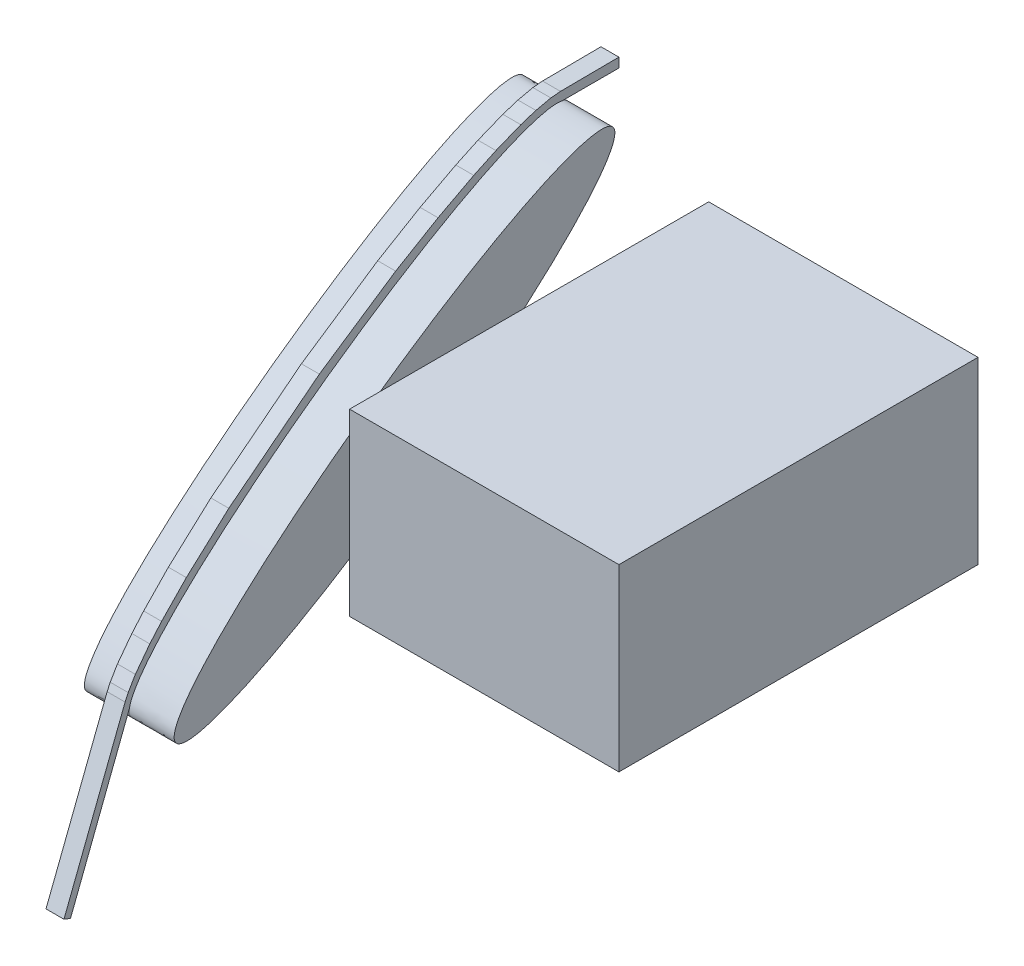
ISO-10303-21;
HEADER;
FILE_DESCRIPTION(('STEP AP214'),'2;1');
FILE_NAME('part.step','',(''),(''),'','','');
FILE_SCHEMA(('AUTOMOTIVE_DESIGN { 1 0 10303 214 1 1 1 1 }'));
ENDSEC;
DATA;
#1=APPLICATION_CONTEXT('core data for automotive mechanical design processes');
#2=APPLICATION_PROTOCOL_DEFINITION('international standard','automotive_design',2000,#1);
#3=PRODUCT_CONTEXT('',#1,'mechanical');
#4=PRODUCT('Part','Part','',(#3));
#5=PRODUCT_RELATED_PRODUCT_CATEGORY('part','',(#4));
#6=PRODUCT_DEFINITION_FORMATION('','',#4);
#7=PRODUCT_DEFINITION_CONTEXT('part definition',#1,'design');
#8=PRODUCT_DEFINITION('design','',#6,#7);
#9=PRODUCT_DEFINITION_SHAPE('','',#8);
#10=(LENGTH_UNIT() NAMED_UNIT(*) SI_UNIT(.MILLI.,.METRE.));
#11=(NAMED_UNIT(*) PLANE_ANGLE_UNIT() SI_UNIT($,.RADIAN.));
#12=(NAMED_UNIT(*) SI_UNIT($,.STERADIAN.) SOLID_ANGLE_UNIT());
#13=UNCERTAINTY_MEASURE_WITH_UNIT(LENGTH_MEASURE(1.E-05),#10,'distance_accuracy_value','');
#14=(GEOMETRIC_REPRESENTATION_CONTEXT(3) GLOBAL_UNCERTAINTY_ASSIGNED_CONTEXT((#13)) GLOBAL_UNIT_ASSIGNED_CONTEXT((#10,
#11,#12)) REPRESENTATION_CONTEXT('',''));
#15=CARTESIAN_POINT('',(0.,0.,0.));
#16=DIRECTION('',(0.,0.,1.));
#17=DIRECTION('',(1.,0.,0.));
#18=AXIS2_PLACEMENT_3D('',#15,#16,#17);
#19=CARTESIAN_POINT('',(0.,0.,40.));
#20=DIRECTION('',(1.,0.,0.));
#21=DIRECTION('',(0.,0.,-1.));
#22=AXIS2_PLACEMENT_3D('',#19,#20,#21);
#23=PLANE('',#22);
#24=CARTESIAN_POINT('',(0.,10.,30.));
#25=DIRECTION('',(1.,0.,0.));
#26=DIRECTION('',(0.,0.,-1.));
#27=AXIS2_PLACEMENT_3D('',#24,#25,#26);
#28=CIRCLE('',#27,2.);
#29=CARTESIAN_POINT('',(0.,10.,28.));
#30=VERTEX_POINT('',#29);
#31=EDGE_CURVE('E11',#30,#30,#28,.F.);
#32=ORIENTED_EDGE('',*,*,#31,.F.);
#33=EDGE_LOOP('',(#32));
#34=FACE_BOUND('',#33,.T.);
#35=DIRECTION('',(0.,-1.,0.));
#36=VECTOR('',#35,1.);
#37=CARTESIAN_POINT('',(0.,0.,0.));
#38=LINE('',#37,#36);
#39=CARTESIAN_POINT('',(0.,20.,0.));
#40=VERTEX_POINT('',#39);
#41=CARTESIAN_POINT('',(0.,0.,0.));
#42=VERTEX_POINT('',#41);
#43=EDGE_CURVE('E504',#40,#42,#38,.T.);
#44=ORIENTED_EDGE('',*,*,#43,.T.);
#45=DIRECTION('',(0.,0.,-1.));
#46=VECTOR('',#45,1.);
#47=CARTESIAN_POINT('',(0.,0.,40.));
#48=LINE('',#47,#46);
#49=CARTESIAN_POINT('',(0.,0.,40.));
#50=VERTEX_POINT('',#49);
#51=EDGE_CURVE('E51',#50,#42,#48,.T.);
#52=ORIENTED_EDGE('',*,*,#51,.F.);
#53=DIRECTION('',(0.,-1.,0.));
#54=VECTOR('',#53,1.);
#55=CARTESIAN_POINT('',(0.,0.,40.));
#56=LINE('',#55,#54);
#57=CARTESIAN_POINT('',(0.,20.,40.));
#58=VERTEX_POINT('',#57);
#59=EDGE_CURVE('E517',#58,#50,#56,.T.);
#60=ORIENTED_EDGE('',*,*,#59,.F.);
#61=DIRECTION('',(0.,0.,-1.));
#62=VECTOR('',#61,1.);
#63=CARTESIAN_POINT('',(0.,20.,40.));
#64=LINE('',#63,#62);
#65=EDGE_CURVE('E521',#58,#40,#64,.T.);
#66=ORIENTED_EDGE('',*,*,#65,.T.);
#67=EDGE_LOOP('',(#44,#52,#60,#66));
#68=FACE_BOUND('',#67,.T.);
#69=ADVANCED_FACE('F43',(#34,#68),#23,.F.);
#70=CARTESIAN_POINT('',(0.,0.,40.));
#71=DIRECTION('',(0.,1.,0.));
#72=DIRECTION('',(0.,0.,1.));
#73=AXIS2_PLACEMENT_3D('',#70,#71,#72);
#74=PLANE('',#73);
#75=DIRECTION('',(1.,0.,0.));
#76=VECTOR('',#75,1.);
#77=CARTESIAN_POINT('',(0.,0.,0.));
#78=LINE('',#77,#76);
#79=CARTESIAN_POINT('',(30.,0.,0.));
#80=VERTEX_POINT('',#79);
#81=EDGE_CURVE('E494',#42,#80,#78,.T.);
#82=ORIENTED_EDGE('',*,*,#81,.T.);
#83=DIRECTION('',(0.,0.,-1.));
#84=VECTOR('',#83,1.);
#85=CARTESIAN_POINT('',(30.,0.,40.));
#86=LINE('',#85,#84);
#87=CARTESIAN_POINT('',(30.,0.,40.));
#88=VERTEX_POINT('',#87);
#89=EDGE_CURVE('E496',#88,#80,#86,.T.);
#90=ORIENTED_EDGE('',*,*,#89,.F.);
#91=DIRECTION('',(1.,0.,0.));
#92=VECTOR('',#91,1.);
#93=CARTESIAN_POINT('',(0.,0.,40.));
#94=LINE('',#93,#92);
#95=EDGE_CURVE('E532',#50,#88,#94,.T.);
#96=ORIENTED_EDGE('',*,*,#95,.F.);
#97=ORIENTED_EDGE('',*,*,#51,.T.);
#98=EDGE_LOOP('',(#82,#90,#96,#97));
#99=FACE_BOUND('',#98,.T.);
#100=ADVANCED_FACE('F484',(#99),#74,.F.);
#101=CARTESIAN_POINT('',(30.,0.,40.));
#102=DIRECTION('',(-1.,0.,0.));
#103=DIRECTION('',(0.,0.,1.));
#104=AXIS2_PLACEMENT_3D('',#101,#102,#103);
#105=PLANE('',#104);
#106=DIRECTION('',(0.,1.,0.));
#107=VECTOR('',#106,1.);
#108=CARTESIAN_POINT('',(30.,0.,0.));
#109=LINE('',#108,#107);
#110=CARTESIAN_POINT('',(30.,20.,0.));
#111=VERTEX_POINT('',#110);
#112=EDGE_CURVE('E503',#80,#111,#109,.T.);
#113=ORIENTED_EDGE('',*,*,#112,.T.);
#114=DIRECTION('',(0.,0.,-1.));
#115=VECTOR('',#114,1.);
#116=CARTESIAN_POINT('',(30.,20.,40.));
#117=LINE('',#116,#115);
#118=CARTESIAN_POINT('',(30.,20.,40.));
#119=VERTEX_POINT('',#118);
#120=EDGE_CURVE('E510',#119,#111,#117,.T.);
#121=ORIENTED_EDGE('',*,*,#120,.F.);
#122=DIRECTION('',(0.,1.,0.));
#123=VECTOR('',#122,1.);
#124=CARTESIAN_POINT('',(30.,0.,40.));
#125=LINE('',#124,#123);
#126=EDGE_CURVE('E508',#88,#119,#125,.T.);
#127=ORIENTED_EDGE('',*,*,#126,.F.);
#128=ORIENTED_EDGE('',*,*,#89,.T.);
#129=EDGE_LOOP('',(#113,#121,#127,#128));
#130=FACE_BOUND('',#129,.T.);
#131=ADVANCED_FACE('F481',(#130),#105,.F.);
#132=CARTESIAN_POINT('',(0.,20.,40.));
#133=DIRECTION('',(0.,-1.,0.));
#134=DIRECTION('',(0.,0.,-1.));
#135=AXIS2_PLACEMENT_3D('',#132,#133,#134);
#136=PLANE('',#135);
#137=DIRECTION('',(-1.,0.,0.));
#138=VECTOR('',#137,1.);
#139=CARTESIAN_POINT('',(0.,20.,0.));
#140=LINE('',#139,#138);
#141=EDGE_CURVE('E513',#111,#40,#140,.T.);
#142=ORIENTED_EDGE('',*,*,#141,.T.);
#143=ORIENTED_EDGE('',*,*,#65,.F.);
#144=DIRECTION('',(-1.,0.,0.));
#145=VECTOR('',#144,1.);
#146=CARTESIAN_POINT('',(0.,20.,40.));
#147=LINE('',#146,#145);
#148=EDGE_CURVE('E525',#119,#58,#147,.T.);
#149=ORIENTED_EDGE('',*,*,#148,.F.);
#150=ORIENTED_EDGE('',*,*,#120,.T.);
#151=EDGE_LOOP('',(#142,#143,#149,#150));
#152=FACE_BOUND('',#151,.T.);
#153=ADVANCED_FACE('F474',(#152),#136,.F.);
#154=CARTESIAN_POINT('',(0.,0.,40.));
#155=DIRECTION('',(0.,0.,-1.));
#156=DIRECTION('',(-1.,0.,0.));
#157=AXIS2_PLACEMENT_3D('',#154,#155,#156);
#158=PLANE('',#157);
#159=ORIENTED_EDGE('',*,*,#59,.T.);
#160=ORIENTED_EDGE('',*,*,#95,.T.);
#161=ORIENTED_EDGE('',*,*,#126,.T.);
#162=ORIENTED_EDGE('',*,*,#148,.T.);
#163=EDGE_LOOP('',(#159,#160,#161,#162));
#164=FACE_BOUND('',#163,.T.);
#165=ADVANCED_FACE('F471',(#164),#158,.F.);
#166=CARTESIAN_POINT('',(0.,0.,0.));
#167=DIRECTION('',(0.,0.,-1.));
#168=DIRECTION('',(-1.,0.,0.));
#169=AXIS2_PLACEMENT_3D('',#166,#167,#168);
#170=PLANE('',#169);
#171=ORIENTED_EDGE('',*,*,#43,.F.);
#172=ORIENTED_EDGE('',*,*,#141,.F.);
#173=ORIENTED_EDGE('',*,*,#112,.F.);
#174=ORIENTED_EDGE('',*,*,#81,.F.);
#175=EDGE_LOOP('',(#171,#172,#173,#174));
#176=FACE_BOUND('',#175,.T.);
#177=ADVANCED_FACE('F469',(#176),#170,.T.);
#178=CARTESIAN_POINT('',(-5.,10.,30.));
#179=DIRECTION('',(1.,0.,0.));
#180=DIRECTION('',(0.,0.,-1.));
#181=AXIS2_PLACEMENT_3D('',#178,#179,#180);
#182=CYLINDRICAL_SURFACE('',#181,2.);
#183=CARTESIAN_POINT('',(-5.,10.,30.));
#184=DIRECTION('',(-1.,0.,0.));
#185=DIRECTION('',(0.,0.,1.));
#186=AXIS2_PLACEMENT_3D('',#183,#184,#185);
#187=CIRCLE('',#186,2.);
#188=CARTESIAN_POINT('',(-5.,10.,32.));
#189=VERTEX_POINT('',#188);
#190=EDGE_CURVE('E540',#189,#189,#187,.T.);
#191=ORIENTED_EDGE('',*,*,#190,.F.);
#192=EDGE_LOOP('',(#191));
#193=FACE_BOUND('',#192,.T.);
#194=ORIENTED_EDGE('',*,*,#31,.T.);
#195=EDGE_LOOP('',(#194));
#196=FACE_BOUND('',#195,.T.);
#197=ADVANCED_FACE('F465',(#193,#196),#182,.T.);
#198=CARTESIAN_POINT('',(-10.,10.,30.));
#199=DIRECTION('',(-1.,0.,0.));
#200=DIRECTION('',(0.,0.583113557238951,-0.812390656866595));
#201=AXIS2_PLACEMENT_3D('',#198,#199,#200);
#202=ELLIPSE('',#201,30.,5.);
#203=DIRECTION('',(1.,0.,0.));
#204=VECTOR('',#203,1.);
#205=SURFACE_OF_LINEAR_EXTRUSION('',#202,#204);
#206=CARTESIAN_POINT('',(-10.,-6.56604898468672,54.5157842310029));
#207=VERTEX_POINT('',#206);
#208=CARTESIAN_POINT('',(-10.,27.9062821800657,6.34848034994793));
#209=VERTEX_POINT('',#208);
#210=EDGE_CURVE('E448',#207,#209,#202,.T.);
#211=ORIENTED_EDGE('',*,*,#210,.F.);
#212=EDGE_CURVE('E548',#209,#207,#202,.T.);
#213=ORIENTED_EDGE('',*,*,#212,.F.);
#214=EDGE_LOOP('',(#211,#213));
#215=FACE_BOUND('',#214,.T.);
#216=CARTESIAN_POINT('',(-5.,10.,30.));
#217=DIRECTION('',(-1.,0.,0.));
#218=DIRECTION('',(0.,0.583113557238951,-0.812390656866595));
#219=AXIS2_PLACEMENT_3D('',#216,#217,#218);
#220=ELLIPSE('',#219,30.,5.);
#221=CARTESIAN_POINT('',(-5.,27.4934067171685,5.62828029400215));
#222=VERTEX_POINT('',#221);
#223=EDGE_CURVE('E447',#222,#222,#220,.T.);
#224=ORIENTED_EDGE('',*,*,#223,.T.);
#225=EDGE_LOOP('',(#224));
#226=FACE_BOUND('',#225,.T.);
#227=ADVANCED_FACE('F461',(#215,#226),#205,.F.);
#228=CARTESIAN_POINT('',(-5.,10.,30.));
#229=DIRECTION('',(-1.,0.,0.));
#230=DIRECTION('',(0.,0.,1.));
#231=AXIS2_PLACEMENT_3D('',#228,#229,#230);
#232=PLANE('',#231);
#233=ORIENTED_EDGE('',*,*,#190,.T.);
#234=EDGE_LOOP('',(#233));
#235=FACE_BOUND('',#234,.T.);
#236=ORIENTED_EDGE('',*,*,#223,.F.);
#237=EDGE_LOOP('',(#236));
#238=FACE_BOUND('',#237,.T.);
#239=ADVANCED_FACE('F457',(#235,#238),#232,.F.);
#240=CARTESIAN_POINT('',(-15.,10.,30.));
#241=DIRECTION('',(-1.,0.,0.));
#242=DIRECTION('',(0.,-0.58311355723895,0.812390656866595));
#243=AXIS2_PLACEMENT_3D('',#240,#241,#242);
#244=ELLIPSE('',#243,30.,5.);
#245=DIRECTION('',(1.,0.,0.));
#246=VECTOR('',#245,1.);
#247=SURFACE_OF_LINEAR_EXTRUSION('',#244,#246);
#248=CARTESIAN_POINT('',(-12.,10.,30.));
#249=DIRECTION('',(-1.,0.,0.));
#250=DIRECTION('',(0.,0.583113557238951,-0.812390656866595));
#251=AXIS2_PLACEMENT_3D('',#248,#249,#250);
#252=ELLIPSE('',#251,30.,5.);
#253=CARTESIAN_POINT('',(-12.,-6.56604898468652,54.5157842310029));
#254=VERTEX_POINT('',#253);
#255=CARTESIAN_POINT('',(-12.,27.9062821800658,6.34848034994794));
#256=VERTEX_POINT('',#255);
#257=EDGE_CURVE('E58',#254,#256,#252,.T.);
#258=ORIENTED_EDGE('',*,*,#257,.T.);
#259=DIRECTION('',(1.,0.,0.));
#260=VECTOR('',#259,1.);
#261=CARTESIAN_POINT('',(-12.,27.9062821800657,6.34848034994793));
#262=LINE('',#261,#260);
#263=EDGE_CURVE('E229',#256,#209,#262,.T.);
#264=ORIENTED_EDGE('',*,*,#263,.T.);
#265=ORIENTED_EDGE('',*,*,#212,.T.);
#266=DIRECTION('',(1.,0.,0.));
#267=VECTOR('',#266,1.);
#268=CARTESIAN_POINT('',(-12.,-6.56604898468652,54.5157842310028));
#269=LINE('',#268,#267);
#270=EDGE_CURVE('E63',#254,#207,#269,.T.);
#271=ORIENTED_EDGE('',*,*,#270,.F.);
#272=EDGE_LOOP('',(#258,#264,#265,#271));
#273=FACE_BOUND('',#272,.T.);
#274=CARTESIAN_POINT('',(-15.,-7.49340671716852,54.3717197059978));
#275=VERTEX_POINT('',#274);
#276=EDGE_CURVE('E228',#275,#275,#244,.T.);
#277=ORIENTED_EDGE('',*,*,#276,.F.);
#278=EDGE_LOOP('',(#277));
#279=FACE_BOUND('',#278,.T.);
#280=ADVANCED_FACE('F452',(#273,#279),#247,.F.);
#281=CARTESIAN_POINT('',(-15.,10.,30.));
#282=DIRECTION('',(-1.,0.,0.));
#283=DIRECTION('',(0.,0.,1.));
#284=AXIS2_PLACEMENT_3D('',#281,#282,#283);
#285=PLANE('',#284);
#286=ORIENTED_EDGE('',*,*,#276,.T.);
#287=EDGE_LOOP('',(#286));
#288=FACE_BOUND('',#287,.T.);
#289=ADVANCED_FACE('F456',(#288),#285,.T.);
#290=CARTESIAN_POINT('',(-12.,0.,0.));
#291=DIRECTION('',(0.,0.,-1.));
#292=DIRECTION('',(0.,1.,0.));
#293=AXIS2_PLACEMENT_3D('',#290,#291,#292);
#294=PLANE('',#293);
#295=DIRECTION('',(0.,1.,0.));
#296=VECTOR('',#295,1.);
#297=CARTESIAN_POINT('',(-10.,0.,0.));
#298=LINE('',#297,#296);
#299=CARTESIAN_POINT('',(-10.,27.9062821800658,0.));
#300=VERTEX_POINT('',#299);
#301=CARTESIAN_POINT('',(-10.,28.9612118153855,0.));
#302=VERTEX_POINT('',#301);
#303=EDGE_CURVE('E222',#300,#302,#298,.T.);
#304=ORIENTED_EDGE('',*,*,#303,.F.);
#305=DIRECTION('',(1.,0.,0.));
#306=VECTOR('',#305,1.);
#307=CARTESIAN_POINT('',(-12.,27.9062821800658,0.));
#308=LINE('',#307,#306);
#309=CARTESIAN_POINT('',(-12.,27.9062821800658,0.));
#310=VERTEX_POINT('',#309);
#311=EDGE_CURVE('E216',#310,#300,#308,.T.);
#312=ORIENTED_EDGE('',*,*,#311,.F.);
#313=DIRECTION('',(0.,1.,0.));
#314=VECTOR('',#313,1.);
#315=CARTESIAN_POINT('',(-12.,0.,0.));
#316=LINE('',#315,#314);
#317=CARTESIAN_POINT('',(-12.,28.9612118153855,0.));
#318=VERTEX_POINT('',#317);
#319=EDGE_CURVE('E219',#310,#318,#316,.T.);
#320=ORIENTED_EDGE('',*,*,#319,.T.);
#321=DIRECTION('',(1.,0.,0.));
#322=VECTOR('',#321,1.);
#323=CARTESIAN_POINT('',(-12.,28.9612118153855,0.));
#324=LINE('',#323,#322);
#325=EDGE_CURVE('E302',#318,#302,#324,.T.);
#326=ORIENTED_EDGE('',*,*,#325,.T.);
#327=EDGE_LOOP('',(#304,#312,#320,#326));
#328=FACE_BOUND('',#327,.T.);
#329=ADVANCED_FACE('F218',(#328),#294,.T.);
#330=CARTESIAN_POINT('',(-12.,27.9062821800658,1.06755557580872E-13));
#331=DIRECTION('',(0.,-1.,0.));
#332=DIRECTION('',(0.,0.,-1.));
#333=AXIS2_PLACEMENT_3D('',#330,#331,#332);
#334=PLANE('',#333);
#335=DIRECTION('',(0.,0.,-1.));
#336=VECTOR('',#335,1.);
#337=CARTESIAN_POINT('',(-10.,27.9062821800658,1.06755557580872E-13));
#338=LINE('',#337,#336);
#339=EDGE_CURVE('E305',#209,#300,#338,.T.);
#340=ORIENTED_EDGE('',*,*,#339,.F.);
#341=ORIENTED_EDGE('',*,*,#263,.F.);
#342=DIRECTION('',(0.,0.,-1.));
#343=VECTOR('',#342,1.);
#344=CARTESIAN_POINT('',(-12.,27.9062821800658,1.06755557580872E-13));
#345=LINE('',#344,#343);
#346=EDGE_CURVE('E234',#256,#310,#345,.T.);
#347=ORIENTED_EDGE('',*,*,#346,.T.);
#348=ORIENTED_EDGE('',*,*,#311,.T.);
#349=EDGE_LOOP('',(#340,#341,#347,#348));
#350=FACE_BOUND('',#349,.T.);
#351=ADVANCED_FACE('F240',(#350),#334,.T.);
#352=CARTESIAN_POINT('',(-12.,17.4734622688178,45.2284010045503));
#353=DIRECTION('',(0.,0.360378691857662,0.932806088345783));
#354=DIRECTION('',(0.,-0.932806088345783,0.360378691857662));
#355=AXIS2_PLACEMENT_3D('',#352,#353,#354);
#356=PLANE('',#355);
#357=DIRECTION('',(0.,-0.932806088345783,0.360378691857662));
#358=VECTOR('',#357,1.);
#359=CARTESIAN_POINT('',(-10.,17.4734622688178,45.2284010045503));
#360=LINE('',#359,#358);
#361=CARTESIAN_POINT('',(-10.,-23.5836024794948,61.0903164341025));
#362=VERTEX_POINT('',#361);
#363=EDGE_CURVE('E308',#207,#362,#360,.T.);
#364=ORIENTED_EDGE('',*,*,#363,.T.);
#365=DIRECTION('',(1.,0.,0.));
#366=VECTOR('',#365,1.);
#367=CARTESIAN_POINT('',(-12.,-23.5836024794948,61.0903164341025));
#368=LINE('',#367,#366);
#369=CARTESIAN_POINT('',(-12.,-23.5836024794948,61.0903164341025));
#370=VERTEX_POINT('',#369);
#371=EDGE_CURVE('E435',#370,#362,#368,.T.);
#372=ORIENTED_EDGE('',*,*,#371,.F.);
#373=DIRECTION('',(0.,-0.932806088345783,0.360378691857662));
#374=VECTOR('',#373,1.);
#375=CARTESIAN_POINT('',(-12.,17.4734622688178,45.2284010045503));
#376=LINE('',#375,#374);
#377=EDGE_CURVE('E244',#254,#370,#376,.T.);
#378=ORIENTED_EDGE('',*,*,#377,.F.);
#379=ORIENTED_EDGE('',*,*,#270,.T.);
#380=EDGE_LOOP('',(#364,#372,#378,#379));
#381=FACE_BOUND('',#380,.T.);
#382=ADVANCED_FACE('F560',(#381),#356,.F.);
#383=CARTESIAN_POINT('',(-12.,-41.0570647483126,15.8619154295522));
#384=DIRECTION('',(0.,0.932806088345783,-0.360378691857662));
#385=DIRECTION('',(0.,0.360378691857662,0.932806088345783));
#386=AXIS2_PLACEMENT_3D('',#383,#384,#385);
#387=PLANE('',#386);
#388=DIRECTION('',(0.,0.360378691857662,0.932806088345783));
#389=VECTOR('',#388,1.);
#390=CARTESIAN_POINT('',(-10.,-41.0570647483126,15.8619154295522));
#391=LINE('',#390,#389);
#392=CARTESIAN_POINT('',(-10.,-23.3017372731283,61.8198978065088));
#393=VERTEX_POINT('',#392);
#394=EDGE_CURVE('E311',#362,#393,#391,.T.);
#395=ORIENTED_EDGE('',*,*,#394,.T.);
#396=DIRECTION('',(1.,0.,0.));
#397=VECTOR('',#396,1.);
#398=CARTESIAN_POINT('',(-12.,-23.3017372731283,61.8198978065088));
#399=LINE('',#398,#397);
#400=CARTESIAN_POINT('',(-12.,-23.3017372731283,61.8198978065088));
#401=VERTEX_POINT('',#400);
#402=EDGE_CURVE('E431',#401,#393,#399,.T.);
#403=ORIENTED_EDGE('',*,*,#402,.F.);
#404=DIRECTION('',(0.,0.360378691857662,0.932806088345783));
#405=VECTOR('',#404,1.);
#406=CARTESIAN_POINT('',(-12.,-41.0570647483126,15.8619154295522));
#407=LINE('',#406,#405);
#408=EDGE_CURVE('E249',#370,#401,#407,.T.);
#409=ORIENTED_EDGE('',*,*,#408,.F.);
#410=ORIENTED_EDGE('',*,*,#371,.T.);
#411=EDGE_LOOP('',(#395,#403,#409,#410));
#412=FACE_BOUND('',#411,.T.);
#413=ADVANCED_FACE('F568',(#412),#387,.F.);
#414=CARTESIAN_POINT('',(-12.,17.8039015004844,45.8626810068503));
#415=DIRECTION('',(0.,-0.361888517195672,-0.932221379888875));
#416=DIRECTION('',(0.,0.932221379888875,-0.361888517195672));
#417=AXIS2_PLACEMENT_3D('',#414,#415,#416);
#418=PLANE('',#417);
#419=DIRECTION('',(0.,0.932221379888875,-0.361888517195672));
#420=VECTOR('',#419,1.);
#421=CARTESIAN_POINT('',(-10.,17.8039015004844,45.8626810068503));
#422=LINE('',#421,#420);
#423=CARTESIAN_POINT('',(-10.,-5.75509594206636,55.0082883003857));
#424=VERTEX_POINT('',#423);
#425=EDGE_CURVE('E314',#393,#424,#422,.T.);
#426=ORIENTED_EDGE('',*,*,#425,.T.);
#427=DIRECTION('',(1.,0.,0.));
#428=VECTOR('',#427,1.);
#429=CARTESIAN_POINT('',(-12.,-5.75509594206636,55.0082883003857));
#430=LINE('',#429,#428);
#431=CARTESIAN_POINT('',(-12.,-5.75509594206636,55.0082883003857));
#432=VERTEX_POINT('',#431);
#433=EDGE_CURVE('E427',#432,#424,#430,.T.);
#434=ORIENTED_EDGE('',*,*,#433,.F.);
#435=DIRECTION('',(0.,0.932221379888875,-0.361888517195672));
#436=VECTOR('',#435,1.);
#437=CARTESIAN_POINT('',(-12.,17.8039015004844,45.8626810068503));
#438=LINE('',#437,#436);
#439=EDGE_CURVE('E252',#401,#432,#438,.T.);
#440=ORIENTED_EDGE('',*,*,#439,.F.);
#441=ORIENTED_EDGE('',*,*,#402,.T.);
#442=EDGE_LOOP('',(#426,#434,#440,#441));
#443=FACE_BOUND('',#442,.T.);
#444=ADVANCED_FACE('F572',(#443),#418,.F.);
#445=CARTESIAN_POINT('',(-12.,19.7218993731715,43.4422496679984));
#446=DIRECTION('',(0.,-0.413375954626984,-0.910560442879126));
#447=DIRECTION('',(0.,0.910560442879126,-0.413375954626984));
#448=AXIS2_PLACEMENT_3D('',#445,#446,#447);
#449=PLANE('',#448);
#450=DIRECTION('',(0.,0.910560442879126,-0.413375954626984));
#451=VECTOR('',#450,1.);
#452=CARTESIAN_POINT('',(-10.,19.7218993731715,43.4422496679984));
#453=LINE('',#452,#451);
#454=CARTESIAN_POINT('',(-10.,-5.00654818095597,54.6684628140572));
#455=VERTEX_POINT('',#454);
#456=EDGE_CURVE('E317',#424,#455,#453,.T.);
#457=ORIENTED_EDGE('',*,*,#456,.T.);
#458=DIRECTION('',(1.,0.,0.));
#459=VECTOR('',#458,1.);
#460=CARTESIAN_POINT('',(-12.,-5.00654818095597,54.6684628140572));
#461=LINE('',#460,#459);
#462=CARTESIAN_POINT('',(-12.,-5.00654818095597,54.6684628140572));
#463=VERTEX_POINT('',#462);
#464=EDGE_CURVE('E423',#463,#455,#461,.T.);
#465=ORIENTED_EDGE('',*,*,#464,.F.);
#466=DIRECTION('',(0.,0.910560442879126,-0.413375954626984));
#467=VECTOR('',#466,1.);
#468=CARTESIAN_POINT('',(-12.,19.7218993731715,43.4422496679984));
#469=LINE('',#468,#467);
#470=EDGE_CURVE('E255',#432,#463,#469,.T.);
#471=ORIENTED_EDGE('',*,*,#470,.F.);
#472=ORIENTED_EDGE('',*,*,#433,.T.);
#473=EDGE_LOOP('',(#457,#465,#471,#472));
#474=FACE_BOUND('',#473,.T.);
#475=ADVANCED_FACE('F579',(#474),#449,.F.);
#476=CARTESIAN_POINT('',(-12.,22.7277693303293,38.1426094390176));
#477=DIRECTION('',(0.,-0.511880185275143,-0.859056852555572));
#478=DIRECTION('',(0.,0.859056852555572,-0.511880185275143));
#479=AXIS2_PLACEMENT_3D('',#476,#477,#478);
#480=PLANE('',#479);
#481=DIRECTION('',(0.,0.859056852555571,-0.511880185275143));
#482=VECTOR('',#481,1.);
#483=CARTESIAN_POINT('',(-10.,22.7277693303293,38.1426094390176));
#484=LINE('',#483,#482);
#485=CARTESIAN_POINT('',(-10.,-3.65106040520048,53.8607778142486));
#486=VERTEX_POINT('',#485);
#487=EDGE_CURVE('E320',#455,#486,#484,.T.);
#488=ORIENTED_EDGE('',*,*,#487,.T.);
#489=DIRECTION('',(1.,0.,0.));
#490=VECTOR('',#489,1.);
#491=CARTESIAN_POINT('',(-12.,-3.65106040520048,53.8607778142486));
#492=LINE('',#491,#490);
#493=CARTESIAN_POINT('',(-12.,-3.65106040520048,53.8607778142486));
#494=VERTEX_POINT('',#493);
#495=EDGE_CURVE('E419',#494,#486,#492,.T.);
#496=ORIENTED_EDGE('',*,*,#495,.F.);
#497=DIRECTION('',(0.,0.859056852555571,-0.511880185275143));
#498=VECTOR('',#497,1.);
#499=CARTESIAN_POINT('',(-12.,22.7277693303293,38.1426094390176));
#500=LINE('',#499,#498);
#501=EDGE_CURVE('E258',#463,#494,#500,.T.);
#502=ORIENTED_EDGE('',*,*,#501,.F.);
#503=ORIENTED_EDGE('',*,*,#464,.T.);
#504=EDGE_LOOP('',(#488,#496,#502,#503));
#505=FACE_BOUND('',#504,.T.);
#506=ADVANCED_FACE('F582',(#505),#480,.F.);
#507=CARTESIAN_POINT('',(-12.,24.5548696608242,32.6446614115996));
#508=DIRECTION('',(0.,-0.601117665225702,-0.799160529902223));
#509=DIRECTION('',(0.,0.799160529902223,-0.601117665225702));
#510=AXIS2_PLACEMENT_3D('',#507,#508,#509);
#511=PLANE('',#510);
#512=DIRECTION('',(0.,0.799160529902223,-0.601117665225702));
#513=VECTOR('',#512,1.);
#514=CARTESIAN_POINT('',(-10.,24.5548696608242,32.6446614115996));
#515=LINE('',#514,#513);
#516=CARTESIAN_POINT('',(-10.,-1.51677646163416,52.2553985029827));
#517=VERTEX_POINT('',#516);
#518=EDGE_CURVE('E323',#486,#517,#515,.T.);
#519=ORIENTED_EDGE('',*,*,#518,.T.);
#520=DIRECTION('',(1.,0.,0.));
#521=VECTOR('',#520,1.);
#522=CARTESIAN_POINT('',(-12.,-1.51677646163416,52.2553985029827));
#523=LINE('',#522,#521);
#524=CARTESIAN_POINT('',(-12.,-1.51677646163416,52.2553985029827));
#525=VERTEX_POINT('',#524);
#526=EDGE_CURVE('E415',#525,#517,#523,.T.);
#527=ORIENTED_EDGE('',*,*,#526,.F.);
#528=DIRECTION('',(0.,0.799160529902223,-0.601117665225702));
#529=VECTOR('',#528,1.);
#530=CARTESIAN_POINT('',(-12.,24.5548696608242,32.6446614115996));
#531=LINE('',#530,#529);
#532=EDGE_CURVE('E261',#494,#525,#531,.T.);
#533=ORIENTED_EDGE('',*,*,#532,.F.);
#534=ORIENTED_EDGE('',*,*,#495,.T.);
#535=EDGE_LOOP('',(#519,#527,#533,#534));
#536=FACE_BOUND('',#535,.T.);
#537=ADVANCED_FACE('F587',(#536),#511,.F.);
#538=CARTESIAN_POINT('',(-12.,25.2128334531527,29.0819275986439));
#539=DIRECTION('',(0.,-0.655056586674391,-0.755579822556489));
#540=DIRECTION('',(0.,0.755579822556489,-0.655056586674391));
#541=AXIS2_PLACEMENT_3D('',#538,#539,#540);
#542=PLANE('',#541);
#543=DIRECTION('',(0.,0.755579822556489,-0.655056586674391));
#544=VECTOR('',#543,1.);
#545=CARTESIAN_POINT('',(-10.,25.2128334531527,29.0819275986439));
#546=LINE('',#545,#544);
#547=CARTESIAN_POINT('',(-10.,0.,50.9404157810455));
#548=VERTEX_POINT('',#547);
#549=EDGE_CURVE('E326',#517,#548,#546,.T.);
#550=ORIENTED_EDGE('',*,*,#549,.T.);
#551=DIRECTION('',(1.,0.,0.));
#552=VECTOR('',#551,1.);
#553=CARTESIAN_POINT('',(-12.,0.,50.9404157810455));
#554=LINE('',#553,#552);
#555=CARTESIAN_POINT('',(-12.,0.,50.9404157810455));
#556=VERTEX_POINT('',#555);
#557=EDGE_CURVE('E411',#556,#548,#554,.T.);
#558=ORIENTED_EDGE('',*,*,#557,.F.);
#559=DIRECTION('',(0.,0.755579822556489,-0.655056586674391));
#560=VECTOR('',#559,1.);
#561=CARTESIAN_POINT('',(-12.,25.2128334531527,29.0819275986439));
#562=LINE('',#561,#560);
#563=EDGE_CURVE('E264',#525,#556,#562,.T.);
#564=ORIENTED_EDGE('',*,*,#563,.F.);
#565=ORIENTED_EDGE('',*,*,#526,.T.);
#566=EDGE_LOOP('',(#550,#558,#564,#565));
#567=FACE_BOUND('',#566,.T.);
#568=ADVANCED_FACE('F593',(#567),#542,.F.);
#569=CARTESIAN_POINT('',(-12.,25.4564196282269,26.3081754901795));
#570=DIRECTION('',(0.,-0.695377626884697,-0.718644526889482));
#571=DIRECTION('',(0.,0.718644526889482,-0.695377626884697));
#572=AXIS2_PLACEMENT_3D('',#569,#570,#571);
#573=PLANE('',#572);
#574=DIRECTION('',(0.,0.718644526889482,-0.695377626884697));
#575=VECTOR('',#574,1.);
#576=CARTESIAN_POINT('',(-10.,25.4564196282269,26.3081754901795));
#577=LINE('',#576,#575);
#578=CARTESIAN_POINT('',(-10.,2.84562683989677,48.1869192123155));
#579=VERTEX_POINT('',#578);
#580=EDGE_CURVE('E329',#548,#579,#577,.T.);
#581=ORIENTED_EDGE('',*,*,#580,.T.);
#582=DIRECTION('',(1.,0.,0.));
#583=VECTOR('',#582,1.);
#584=CARTESIAN_POINT('',(-12.,2.84562683989677,48.1869192123155));
#585=LINE('',#584,#583);
#586=CARTESIAN_POINT('',(-12.,2.84562683989677,48.1869192123155));
#587=VERTEX_POINT('',#586);
#588=EDGE_CURVE('E407',#587,#579,#585,.T.);
#589=ORIENTED_EDGE('',*,*,#588,.F.);
#590=DIRECTION('',(0.,0.718644526889482,-0.695377626884697));
#591=VECTOR('',#590,1.);
#592=CARTESIAN_POINT('',(-12.,25.4564196282269,26.3081754901795));
#593=LINE('',#592,#591);
#594=EDGE_CURVE('E267',#556,#587,#593,.T.);
#595=ORIENTED_EDGE('',*,*,#594,.F.);
#596=ORIENTED_EDGE('',*,*,#557,.T.);
#597=EDGE_LOOP('',(#581,#589,#595,#596));
#598=FACE_BOUND('',#597,.T.);
#599=ADVANCED_FACE('F597',(#598),#573,.F.);
#600=CARTESIAN_POINT('',(-12.,25.5454502539139,23.3075932064755));
#601=DIRECTION('',(0.,-0.738723232736995,-0.674008891198479));
#602=DIRECTION('',(0.,0.674008891198479,-0.738723232736995));
#603=AXIS2_PLACEMENT_3D('',#600,#601,#602);
#604=PLANE('',#603);
#605=DIRECTION('',(0.,0.674008891198479,-0.738723232736995));
#606=VECTOR('',#605,1.);
#607=CARTESIAN_POINT('',(-10.,25.5454502539139,23.3075932064755));
#608=LINE('',#607,#606);
#609=CARTESIAN_POINT('',(-10.,7.16350306163727,43.4544660907987));
#610=VERTEX_POINT('',#609);
#611=EDGE_CURVE('E332',#579,#610,#608,.T.);
#612=ORIENTED_EDGE('',*,*,#611,.T.);
#613=DIRECTION('',(1.,0.,0.));
#614=VECTOR('',#613,1.);
#615=CARTESIAN_POINT('',(-12.,7.16350306163727,43.4544660907987));
#616=LINE('',#615,#614);
#617=CARTESIAN_POINT('',(-12.,7.16350306163727,43.4544660907987));
#618=VERTEX_POINT('',#617);
#619=EDGE_CURVE('E403',#618,#610,#616,.T.);
#620=ORIENTED_EDGE('',*,*,#619,.F.);
#621=DIRECTION('',(0.,0.674008891198479,-0.738723232736995));
#622=VECTOR('',#621,1.);
#623=CARTESIAN_POINT('',(-12.,25.5454502539139,23.3075932064755));
#624=LINE('',#623,#622);
#625=EDGE_CURVE('E270',#587,#618,#624,.T.);
#626=ORIENTED_EDGE('',*,*,#625,.F.);
#627=ORIENTED_EDGE('',*,*,#588,.T.);
#628=EDGE_LOOP('',(#612,#620,#626,#627));
#629=FACE_BOUND('',#628,.T.);
#630=ADVANCED_FACE('F602',(#629),#604,.F.);
#631=CARTESIAN_POINT('',(-12.,25.5340672304347,19.9959227722235));
#632=DIRECTION('',(0.,-0.787314312181738,-0.616551841967727));
#633=DIRECTION('',(0.,0.616551841967727,-0.787314312181738));
#634=AXIS2_PLACEMENT_3D('',#631,#632,#633);
#635=PLANE('',#634);
#636=DIRECTION('',(0.,0.616551841967727,-0.787314312181738));
#637=VECTOR('',#636,1.);
#638=CARTESIAN_POINT('',(-10.,25.5340672304347,19.9959227722235));
#639=LINE('',#638,#637);
#640=CARTESIAN_POINT('',(-10.,15.0621928592897,33.3681260592314));
#641=VERTEX_POINT('',#640);
#642=EDGE_CURVE('E335',#610,#641,#639,.T.);
#643=ORIENTED_EDGE('',*,*,#642,.T.);
#644=DIRECTION('',(1.,0.,0.));
#645=VECTOR('',#644,1.);
#646=CARTESIAN_POINT('',(-12.,15.0621928592897,33.3681260592314));
#647=LINE('',#646,#645);
#648=CARTESIAN_POINT('',(-12.,15.0621928592897,33.3681260592314));
#649=VERTEX_POINT('',#648);
#650=EDGE_CURVE('E399',#649,#641,#647,.T.);
#651=ORIENTED_EDGE('',*,*,#650,.F.);
#652=DIRECTION('',(0.,0.616551841967727,-0.787314312181738));
#653=VECTOR('',#652,1.);
#654=CARTESIAN_POINT('',(-12.,25.5340672304347,19.9959227722235));
#655=LINE('',#654,#653);
#656=EDGE_CURVE('E273',#618,#649,#655,.T.);
#657=ORIENTED_EDGE('',*,*,#656,.F.);
#658=ORIENTED_EDGE('',*,*,#619,.T.);
#659=EDGE_LOOP('',(#643,#651,#657,#658));
#660=FACE_BOUND('',#659,.T.);
#661=ADVANCED_FACE('F608',(#660),#635,.F.);
#662=CARTESIAN_POINT('',(-12.,25.8263707668245,17.2826526520887));
#663=DIRECTION('',(0.,-0.831082571648941,-0.556149043963381));
#664=DIRECTION('',(0.,0.556149043963381,-0.831082571648941));
#665=AXIS2_PLACEMENT_3D('',#662,#663,#664);
#666=PLANE('',#665);
#667=DIRECTION('',(0.,0.556149043963381,-0.831082571648941));
#668=VECTOR('',#667,1.);
#669=CARTESIAN_POINT('',(-10.,25.8263707668245,17.2826526520887));
#670=LINE('',#669,#668);
#671=CARTESIAN_POINT('',(-10.,20.7492860321962,24.8696056164678));
#672=VERTEX_POINT('',#671);
#673=EDGE_CURVE('E338',#641,#672,#670,.T.);
#674=ORIENTED_EDGE('',*,*,#673,.T.);
#675=DIRECTION('',(1.,0.,0.));
#676=VECTOR('',#675,1.);
#677=CARTESIAN_POINT('',(-12.,20.7492860321962,24.8696056164678));
#678=LINE('',#677,#676);
#679=CARTESIAN_POINT('',(-12.,20.7492860321962,24.8696056164678));
#680=VERTEX_POINT('',#679);
#681=EDGE_CURVE('E395',#680,#672,#678,.T.);
#682=ORIENTED_EDGE('',*,*,#681,.F.);
#683=DIRECTION('',(0.,0.556149043963381,-0.831082571648941));
#684=VECTOR('',#683,1.);
#685=CARTESIAN_POINT('',(-12.,25.8263707668245,17.2826526520887));
#686=LINE('',#685,#684);
#687=EDGE_CURVE('E276',#649,#680,#686,.T.);
#688=ORIENTED_EDGE('',*,*,#687,.F.);
#689=ORIENTED_EDGE('',*,*,#650,.T.);
#690=EDGE_LOOP('',(#674,#682,#688,#689));
#691=FACE_BOUND('',#690,.T.);
#692=ADVANCED_FACE('F612',(#691),#666,.F.);
#693=CARTESIAN_POINT('',(-12.,26.2742443504519,15.510549221667));
#694=DIRECTION('',(0.,-0.861143790817123,-0.508361457564512));
#695=DIRECTION('',(0.,0.508361457564512,-0.861143790817123));
#696=AXIS2_PLACEMENT_3D('',#693,#694,#695);
#697=PLANE('',#696);
#698=DIRECTION('',(0.,0.508361457564512,-0.861143790817123));
#699=VECTOR('',#698,1.);
#700=CARTESIAN_POINT('',(-10.,26.2742443504519,15.510549221667));
#701=LINE('',#700,#699);
#702=CARTESIAN_POINT('',(-10.,23.5370052377955,20.1473217990742));
#703=VERTEX_POINT('',#702);
#704=EDGE_CURVE('E341',#672,#703,#701,.T.);
#705=ORIENTED_EDGE('',*,*,#704,.T.);
#706=DIRECTION('',(1.,0.,0.));
#707=VECTOR('',#706,1.);
#708=CARTESIAN_POINT('',(-12.,23.5370052377955,20.1473217990742));
#709=LINE('',#708,#707);
#710=CARTESIAN_POINT('',(-12.,23.5370052377955,20.1473217990742));
#711=VERTEX_POINT('',#710);
#712=EDGE_CURVE('E391',#711,#703,#709,.T.);
#713=ORIENTED_EDGE('',*,*,#712,.F.);
#714=DIRECTION('',(0.,0.508361457564512,-0.861143790817123));
#715=VECTOR('',#714,1.);
#716=CARTESIAN_POINT('',(-12.,26.2742443504519,15.510549221667));
#717=LINE('',#716,#715);
#718=EDGE_CURVE('E279',#680,#711,#717,.T.);
#719=ORIENTED_EDGE('',*,*,#718,.F.);
#720=ORIENTED_EDGE('',*,*,#681,.T.);
#721=EDGE_LOOP('',(#705,#713,#719,#720));
#722=FACE_BOUND('',#721,.T.);
#723=ADVANCED_FACE('F617',(#722),#697,.F.);
#724=CARTESIAN_POINT('',(-12.,26.725955934361,14.1048999306047));
#725=DIRECTION('',(0.,-0.884391114158572,-0.466746566347691));
#726=DIRECTION('',(0.,0.466746566347691,-0.884391114158572));
#727=AXIS2_PLACEMENT_3D('',#724,#725,#726);
#728=PLANE('',#727);
#729=DIRECTION('',(0.,0.466746566347691,-0.884391114158572));
#730=VECTOR('',#729,1.);
#731=CARTESIAN_POINT('',(-10.,26.725955934361,14.1048999306047));
#732=LINE('',#731,#730);
#733=CARTESIAN_POINT('',(-10.,25.6365826231705,16.1690438277034));
#734=VERTEX_POINT('',#733);
#735=EDGE_CURVE('E344',#703,#734,#732,.T.);
#736=ORIENTED_EDGE('',*,*,#735,.T.);
#737=DIRECTION('',(1.,0.,0.));
#738=VECTOR('',#737,1.);
#739=CARTESIAN_POINT('',(-12.,25.6365826231705,16.1690438277034));
#740=LINE('',#739,#738);
#741=CARTESIAN_POINT('',(-12.,25.6365826231705,16.1690438277034));
#742=VERTEX_POINT('',#741);
#743=EDGE_CURVE('E387',#742,#734,#740,.T.);
#744=ORIENTED_EDGE('',*,*,#743,.F.);
#745=DIRECTION('',(0.,0.466746566347691,-0.884391114158572));
#746=VECTOR('',#745,1.);
#747=CARTESIAN_POINT('',(-12.,26.725955934361,14.1048999306047));
#748=LINE('',#747,#746);
#749=EDGE_CURVE('E282',#711,#742,#748,.T.);
#750=ORIENTED_EDGE('',*,*,#749,.F.);
#751=ORIENTED_EDGE('',*,*,#712,.T.);
#752=EDGE_LOOP('',(#736,#744,#750,#751));
#753=FACE_BOUND('',#752,.T.);
#754=ADVANCED_FACE('F623',(#753),#728,.F.);
#755=CARTESIAN_POINT('',(-12.,27.2350637356796,12.7562196348183));
#756=DIRECTION('',(0.,-0.905589445123477,-0.424155345222658));
#757=DIRECTION('',(0.,0.424155345222658,-0.905589445123477));
#758=AXIS2_PLACEMENT_3D('',#755,#756,#757);
#759=PLANE('',#758);
#760=DIRECTION('',(0.,0.424155345222658,-0.905589445123477));
#761=VECTOR('',#760,1.);
#762=CARTESIAN_POINT('',(-10.,27.2350637356796,12.7562196348183));
#763=LINE('',#762,#761);
#764=CARTESIAN_POINT('',(-10.,26.7944071829696,13.6970398497542));
#765=VERTEX_POINT('',#764);
#766=EDGE_CURVE('E347',#734,#765,#763,.T.);
#767=ORIENTED_EDGE('',*,*,#766,.T.);
#768=DIRECTION('',(1.,0.,0.));
#769=VECTOR('',#768,1.);
#770=CARTESIAN_POINT('',(-12.,26.7944071829696,13.6970398497542));
#771=LINE('',#770,#769);
#772=CARTESIAN_POINT('',(-12.,26.7944071829696,13.6970398497542));
#773=VERTEX_POINT('',#772);
#774=EDGE_CURVE('E383',#773,#765,#771,.T.);
#775=ORIENTED_EDGE('',*,*,#774,.F.);
#776=DIRECTION('',(0.,0.424155345222658,-0.905589445123477));
#777=VECTOR('',#776,1.);
#778=CARTESIAN_POINT('',(-12.,27.2350637356796,12.7562196348183));
#779=LINE('',#778,#777);
#780=EDGE_CURVE('E285',#742,#773,#779,.T.);
#781=ORIENTED_EDGE('',*,*,#780,.F.);
#782=ORIENTED_EDGE('',*,*,#743,.T.);
#783=EDGE_LOOP('',(#767,#775,#781,#782));
#784=FACE_BOUND('',#783,.T.);
#785=ADVANCED_FACE('F627',(#784),#759,.F.);
#786=CARTESIAN_POINT('',(-12.,27.8095295413859,11.1696482436081));
#787=DIRECTION('',(0.,-0.927948351297151,-0.372708810366618));
#788=DIRECTION('',(0.,0.372708810366618,-0.927948351297151));
#789=AXIS2_PLACEMENT_3D('',#786,#787,#788);
#790=PLANE('',#789);
#791=DIRECTION('',(0.,0.372708810366618,-0.927948351297151));
#792=VECTOR('',#791,1.);
#793=CARTESIAN_POINT('',(-10.,27.8095295413859,11.1696482436081));
#794=LINE('',#793,#792);
#795=CARTESIAN_POINT('',(-10.,27.9062821800658,10.9287592464892));
#796=VERTEX_POINT('',#795);
#797=EDGE_CURVE('E350',#765,#796,#794,.T.);
#798=ORIENTED_EDGE('',*,*,#797,.T.);
#799=DIRECTION('',(1.,0.,0.));
#800=VECTOR('',#799,1.);
#801=CARTESIAN_POINT('',(-12.,27.9062821800658,10.9287592464892));
#802=LINE('',#801,#800);
#803=CARTESIAN_POINT('',(-12.,27.9062821800658,10.9287592464892));
#804=VERTEX_POINT('',#803);
#805=EDGE_CURVE('E379',#804,#796,#802,.T.);
#806=ORIENTED_EDGE('',*,*,#805,.F.);
#807=DIRECTION('',(0.,0.372708810366618,-0.927948351297151));
#808=VECTOR('',#807,1.);
#809=CARTESIAN_POINT('',(-12.,27.8095295413859,11.1696482436081));
#810=LINE('',#809,#808);
#811=EDGE_CURVE('E288',#773,#804,#810,.T.);
#812=ORIENTED_EDGE('',*,*,#811,.F.);
#813=ORIENTED_EDGE('',*,*,#774,.T.);
#814=EDGE_LOOP('',(#798,#806,#812,#813));
#815=FACE_BOUND('',#814,.T.);
#816=ADVANCED_FACE('F632',(#815),#790,.F.);
#817=CARTESIAN_POINT('',(-12.,28.4844852057713,9.12356384042898));
#818=DIRECTION('',(0.,-0.952341342356574,-0.305034371241142));
#819=DIRECTION('',(0.,0.305034371241142,-0.952341342356574));
#820=AXIS2_PLACEMENT_3D('',#817,#818,#819);
#821=PLANE('',#820);
#822=DIRECTION('',(0.,0.305034371241142,-0.952341342356574));
#823=VECTOR('',#822,1.);
#824=CARTESIAN_POINT('',(-10.,28.4844852057713,9.12356384042898));
#825=LINE('',#824,#823);
#826=CARTESIAN_POINT('',(-10.,28.444330814732,9.24892901323971));
#827=VERTEX_POINT('',#826);
#828=EDGE_CURVE('E353',#796,#827,#825,.T.);
#829=ORIENTED_EDGE('',*,*,#828,.T.);
#830=DIRECTION('',(1.,0.,0.));
#831=VECTOR('',#830,1.);
#832=CARTESIAN_POINT('',(-12.,28.444330814732,9.24892901323971));
#833=LINE('',#832,#831);
#834=CARTESIAN_POINT('',(-12.,28.444330814732,9.24892901323971));
#835=VERTEX_POINT('',#834);
#836=EDGE_CURVE('E375',#835,#827,#833,.T.);
#837=ORIENTED_EDGE('',*,*,#836,.F.);
#838=DIRECTION('',(0.,0.305034371241142,-0.952341342356574));
#839=VECTOR('',#838,1.);
#840=CARTESIAN_POINT('',(-12.,28.4844852057713,9.12356384042898));
#841=LINE('',#840,#839);
#842=EDGE_CURVE('E291',#804,#835,#841,.T.);
#843=ORIENTED_EDGE('',*,*,#842,.F.);
#844=ORIENTED_EDGE('',*,*,#805,.T.);
#845=EDGE_LOOP('',(#829,#837,#843,#844));
#846=FACE_BOUND('',#845,.T.);
#847=ADVANCED_FACE('F638',(#846),#821,.F.);
#848=CARTESIAN_POINT('',(-12.,29.0629237265178,6.47042045408708));
#849=DIRECTION('',(0.,-0.976101687339251,-0.217314279267302));
#850=DIRECTION('',(0.,0.217314279267302,-0.976101687339251));
#851=AXIS2_PLACEMENT_3D('',#848,#849,#850);
#852=PLANE('',#851);
#853=DIRECTION('',(0.,0.217314279267302,-0.976101687339251));
#854=VECTOR('',#853,1.);
#855=CARTESIAN_POINT('',(-10.,29.0629237265178,6.47042045408708));
#856=LINE('',#855,#854);
#857=CARTESIAN_POINT('',(-10.,28.8145859436979,7.58586914737068));
#858=VERTEX_POINT('',#857);
#859=EDGE_CURVE('E356',#827,#858,#856,.T.);
#860=ORIENTED_EDGE('',*,*,#859,.T.);
#861=DIRECTION('',(1.,0.,0.));
#862=VECTOR('',#861,1.);
#863=CARTESIAN_POINT('',(-12.,28.8145859436979,7.58586914737068));
#864=LINE('',#863,#862);
#865=CARTESIAN_POINT('',(-12.,28.8145859436979,7.58586914737068));
#866=VERTEX_POINT('',#865);
#867=EDGE_CURVE('E371',#866,#858,#864,.T.);
#868=ORIENTED_EDGE('',*,*,#867,.F.);
#869=DIRECTION('',(0.,0.217314279267302,-0.976101687339251));
#870=VECTOR('',#869,1.);
#871=CARTESIAN_POINT('',(-12.,29.0629237265178,6.47042045408708));
#872=LINE('',#871,#870);
#873=EDGE_CURVE('E294',#835,#866,#872,.T.);
#874=ORIENTED_EDGE('',*,*,#873,.F.);
#875=ORIENTED_EDGE('',*,*,#836,.T.);
#876=EDGE_LOOP('',(#860,#868,#874,#875));
#877=FACE_BOUND('',#876,.T.);
#878=ADVANCED_FACE('F642',(#877),#852,.F.);
#879=CARTESIAN_POINT('',(-12.,29.256313451239,2.58337504244955));
#880=DIRECTION('',(0.,-0.9961240777136,-0.087959205312637));
#881=DIRECTION('',(0.,0.087959205312637,-0.9961240777136));
#882=AXIS2_PLACEMENT_3D('',#879,#880,#881);
#883=PLANE('',#882);
#884=DIRECTION('',(0.,0.087959205312637,-0.9961240777136));
#885=VECTOR('',#884,1.);
#886=CARTESIAN_POINT('',(-10.,29.256313451239,2.58337504244955));
#887=LINE('',#886,#885);
#888=CARTESIAN_POINT('',(-10.,28.9098558343766,6.50695271504473));
#889=VERTEX_POINT('',#888);
#890=EDGE_CURVE('E359',#858,#889,#887,.T.);
#891=ORIENTED_EDGE('',*,*,#890,.T.);
#892=DIRECTION('',(1.,0.,0.));
#893=VECTOR('',#892,1.);
#894=CARTESIAN_POINT('',(-12.,28.9098558343766,6.50695271504473));
#895=LINE('',#894,#893);
#896=CARTESIAN_POINT('',(-12.,28.9098558343766,6.50695271504473));
#897=VERTEX_POINT('',#896);
#898=EDGE_CURVE('E368',#897,#889,#895,.T.);
#899=ORIENTED_EDGE('',*,*,#898,.F.);
#900=DIRECTION('',(0.,0.087959205312637,-0.9961240777136));
#901=VECTOR('',#900,1.);
#902=CARTESIAN_POINT('',(-12.,29.256313451239,2.58337504244955));
#903=LINE('',#902,#901);
#904=EDGE_CURVE('E297',#866,#897,#903,.T.);
#905=ORIENTED_EDGE('',*,*,#904,.F.);
#906=ORIENTED_EDGE('',*,*,#867,.T.);
#907=EDGE_LOOP('',(#891,#899,#905,#906));
#908=FACE_BOUND('',#907,.T.);
#909=ADVANCED_FACE('F647',(#908),#883,.F.);
#910=CARTESIAN_POINT('',(-12.,28.959407898866,0.228561489104379));
#911=DIRECTION('',(0.,0.999968855850679,0.00789223217371731));
#912=DIRECTION('',(0.,-0.00789223217371731,0.999968855850679));
#913=AXIS2_PLACEMENT_3D('',#910,#911,#912);
#914=PLANE('',#913);
#915=DIRECTION('',(0.,-0.00789223217371731,0.999968855850679));
#916=VECTOR('',#915,1.);
#917=CARTESIAN_POINT('',(-10.,28.959407898866,0.228561489104379));
#918=LINE('',#917,#916);
#919=EDGE_CURVE('E238',#302,#889,#918,.T.);
#920=ORIENTED_EDGE('',*,*,#919,.F.);
#921=ORIENTED_EDGE('',*,*,#325,.F.);
#922=DIRECTION('',(0.,-0.00789223217371731,0.999968855850679));
#923=VECTOR('',#922,1.);
#924=CARTESIAN_POINT('',(-12.,28.959407898866,0.228561489104379));
#925=LINE('',#924,#923);
#926=EDGE_CURVE('E236',#318,#897,#925,.T.);
#927=ORIENTED_EDGE('',*,*,#926,.T.);
#928=ORIENTED_EDGE('',*,*,#898,.T.);
#929=EDGE_LOOP('',(#920,#921,#927,#928));
#930=FACE_BOUND('',#929,.T.);
#931=ADVANCED_FACE('F650',(#930),#914,.T.);
#932=CARTESIAN_POINT('',(-12.,0.,0.));
#933=DIRECTION('',(-1.,0.,0.));
#934=DIRECTION('',(0.,0.,1.));
#935=AXIS2_PLACEMENT_3D('',#932,#933,#934);
#936=PLANE('',#935);
#937=ORIENTED_EDGE('',*,*,#319,.F.);
#938=ORIENTED_EDGE('',*,*,#346,.F.);
#939=ORIENTED_EDGE('',*,*,#257,.F.);
#940=ORIENTED_EDGE('',*,*,#377,.T.);
#941=ORIENTED_EDGE('',*,*,#408,.T.);
#942=ORIENTED_EDGE('',*,*,#439,.T.);
#943=ORIENTED_EDGE('',*,*,#470,.T.);
#944=ORIENTED_EDGE('',*,*,#501,.T.);
#945=ORIENTED_EDGE('',*,*,#532,.T.);
#946=ORIENTED_EDGE('',*,*,#563,.T.);
#947=ORIENTED_EDGE('',*,*,#594,.T.);
#948=ORIENTED_EDGE('',*,*,#625,.T.);
#949=ORIENTED_EDGE('',*,*,#656,.T.);
#950=ORIENTED_EDGE('',*,*,#687,.T.);
#951=ORIENTED_EDGE('',*,*,#718,.T.);
#952=ORIENTED_EDGE('',*,*,#749,.T.);
#953=ORIENTED_EDGE('',*,*,#780,.T.);
#954=ORIENTED_EDGE('',*,*,#811,.T.);
#955=ORIENTED_EDGE('',*,*,#842,.T.);
#956=ORIENTED_EDGE('',*,*,#873,.T.);
#957=ORIENTED_EDGE('',*,*,#904,.T.);
#958=ORIENTED_EDGE('',*,*,#926,.F.);
#959=EDGE_LOOP('',(#937,#938,#939,#940,#941,#942,#943,#944,#945,#946,#947,#948,#949,#950,#951,
#952,#953,#954,#955,#956,#957,#958));
#960=FACE_BOUND('',#959,.T.);
#961=ADVANCED_FACE('F233',(#960),#936,.T.);
#962=CARTESIAN_POINT('',(-10.,0.,0.));
#963=DIRECTION('',(-1.,0.,0.));
#964=DIRECTION('',(0.,0.,1.));
#965=AXIS2_PLACEMENT_3D('',#962,#963,#964);
#966=PLANE('',#965);
#967=ORIENTED_EDGE('',*,*,#303,.T.);
#968=ORIENTED_EDGE('',*,*,#919,.T.);
#969=ORIENTED_EDGE('',*,*,#890,.F.);
#970=ORIENTED_EDGE('',*,*,#859,.F.);
#971=ORIENTED_EDGE('',*,*,#828,.F.);
#972=ORIENTED_EDGE('',*,*,#797,.F.);
#973=ORIENTED_EDGE('',*,*,#766,.F.);
#974=ORIENTED_EDGE('',*,*,#735,.F.);
#975=ORIENTED_EDGE('',*,*,#704,.F.);
#976=ORIENTED_EDGE('',*,*,#673,.F.);
#977=ORIENTED_EDGE('',*,*,#642,.F.);
#978=ORIENTED_EDGE('',*,*,#611,.F.);
#979=ORIENTED_EDGE('',*,*,#580,.F.);
#980=ORIENTED_EDGE('',*,*,#549,.F.);
#981=ORIENTED_EDGE('',*,*,#518,.F.);
#982=ORIENTED_EDGE('',*,*,#487,.F.);
#983=ORIENTED_EDGE('',*,*,#456,.F.);
#984=ORIENTED_EDGE('',*,*,#425,.F.);
#985=ORIENTED_EDGE('',*,*,#394,.F.);
#986=ORIENTED_EDGE('',*,*,#363,.F.);
#987=ORIENTED_EDGE('',*,*,#210,.T.);
#988=ORIENTED_EDGE('',*,*,#339,.T.);
#989=EDGE_LOOP('',(#967,#968,#969,#970,#971,#972,#973,#974,#975,#976,#977,#978,#979,#980,#981,
#982,#983,#984,#985,#986,#987,#988));
#990=FACE_BOUND('',#989,.T.);
#991=ADVANCED_FACE('F563',(#990),#966,.F.);
#992=CLOSED_SHELL('',(#69,#100,#131,#153,#165,#177,#197,#227,#239,#280,#289,#329,#351,#382,#413,
#444,#475,#506,#537,#568,#599,#630,#661,#692,#723,#754,#785,#816,#847,#878,#909,#931,#961,#991));
#993=MANIFOLD_SOLID_BREP('B2',#992);
#994=ADVANCED_BREP_SHAPE_REPRESENTATION('',(#18,#993),#14);
#995=SHAPE_DEFINITION_REPRESENTATION(#9,#994);
ENDSEC;
END-ISO-10303-21;
